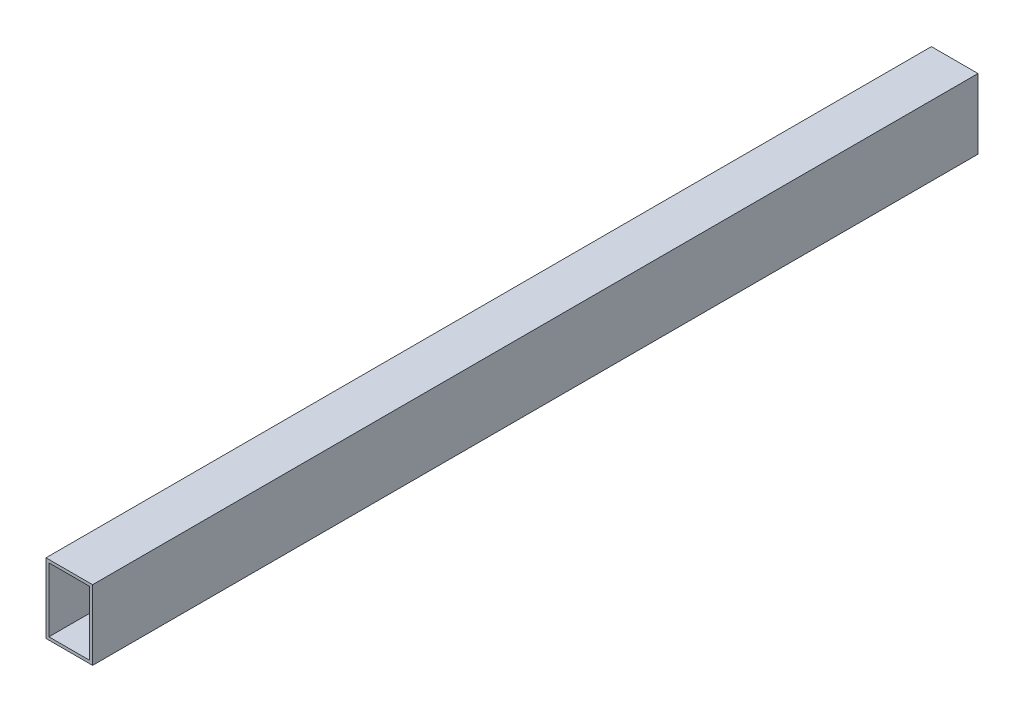
ISO-10303-21;
HEADER;
FILE_DESCRIPTION(('STEP AP214'),'2;1');
FILE_NAME('part.step','',(''),(''),'','','');
FILE_SCHEMA(('AUTOMOTIVE_DESIGN { 1 0 10303 214 1 1 1 1 }'));
ENDSEC;
DATA;
#1=APPLICATION_CONTEXT('core data for automotive mechanical design processes');
#2=APPLICATION_PROTOCOL_DEFINITION('international standard','automotive_design',2000,#1);
#3=PRODUCT_CONTEXT('',#1,'mechanical');
#4=PRODUCT('Part','Part','',(#3));
#5=PRODUCT_RELATED_PRODUCT_CATEGORY('part','',(#4));
#6=PRODUCT_DEFINITION_FORMATION('','',#4);
#7=PRODUCT_DEFINITION_CONTEXT('part definition',#1,'design');
#8=PRODUCT_DEFINITION('design','',#6,#7);
#9=PRODUCT_DEFINITION_SHAPE('','',#8);
#10=(LENGTH_UNIT() NAMED_UNIT(*) SI_UNIT(.MILLI.,.METRE.));
#11=(NAMED_UNIT(*) PLANE_ANGLE_UNIT() SI_UNIT($,.RADIAN.));
#12=(NAMED_UNIT(*) SI_UNIT($,.STERADIAN.) SOLID_ANGLE_UNIT());
#13=UNCERTAINTY_MEASURE_WITH_UNIT(LENGTH_MEASURE(1.E-05),#10,'distance_accuracy_value','');
#14=(GEOMETRIC_REPRESENTATION_CONTEXT(3) GLOBAL_UNCERTAINTY_ASSIGNED_CONTEXT((#13)) GLOBAL_UNIT_ASSIGNED_CONTEXT((#10,
#11,#12)) REPRESENTATION_CONTEXT('',''));
#15=CARTESIAN_POINT('',(0.,0.,0.));
#16=DIRECTION('',(0.,0.,1.));
#17=DIRECTION('',(1.,0.,0.));
#18=AXIS2_PLACEMENT_3D('',#15,#16,#17);
#19=CARTESIAN_POINT('',(0.,0.,965.2));
#20=DIRECTION('',(0.,0.,1.));
#21=DIRECTION('',(1.,0.,0.));
#22=AXIS2_PLACEMENT_3D('',#19,#20,#21);
#23=PLANE('',#22);
#24=DIRECTION('',(0.,1.,0.));
#25=VECTOR('',#24,1.);
#26=CARTESIAN_POINT('',(25.4,38.1,965.2));
#27=LINE('',#26,#25);
#28=CARTESIAN_POINT('',(25.4,-38.1,965.2));
#29=VERTEX_POINT('',#28);
#30=CARTESIAN_POINT('',(25.4,38.1,965.2));
#31=VERTEX_POINT('',#30);
#32=EDGE_CURVE('E153',#29,#31,#27,.T.);
#33=ORIENTED_EDGE('',*,*,#32,.T.);
#34=DIRECTION('',(-1.,0.,0.));
#35=VECTOR('',#34,1.);
#36=CARTESIAN_POINT('',(-25.4,38.1,965.2));
#37=LINE('',#36,#35);
#38=CARTESIAN_POINT('',(-25.4,38.1,965.2));
#39=VERTEX_POINT('',#38);
#40=EDGE_CURVE('E157',#31,#39,#37,.T.);
#41=ORIENTED_EDGE('',*,*,#40,.T.);
#42=DIRECTION('',(0.,-1.,0.));
#43=VECTOR('',#42,1.);
#44=CARTESIAN_POINT('',(-25.4,38.1,965.2));
#45=LINE('',#44,#43);
#46=CARTESIAN_POINT('',(-25.3999999999999,-38.1,965.2));
#47=VERTEX_POINT('',#46);
#48=EDGE_CURVE('E161',#39,#47,#45,.T.);
#49=ORIENTED_EDGE('',*,*,#48,.T.);
#50=DIRECTION('',(1.,0.,0.));
#51=VECTOR('',#50,1.);
#52=CARTESIAN_POINT('',(-25.3999999999999,-38.1,965.2));
#53=LINE('',#52,#51);
#54=EDGE_CURVE('E164',#47,#29,#53,.T.);
#55=ORIENTED_EDGE('',*,*,#54,.T.);
#56=EDGE_LOOP('',(#33,#41,#49,#55));
#57=FACE_BOUND('',#56,.T.);
#58=DIRECTION('',(1.,0.,0.));
#59=VECTOR('',#58,1.);
#60=CARTESIAN_POINT('',(-22.225,-34.925,965.2));
#61=LINE('',#60,#59);
#62=CARTESIAN_POINT('',(-22.225,-34.925,965.2));
#63=VERTEX_POINT('',#62);
#64=CARTESIAN_POINT('',(22.225,-34.925,965.2));
#65=VERTEX_POINT('',#64);
#66=EDGE_CURVE('E114',#63,#65,#61,.T.);
#67=ORIENTED_EDGE('',*,*,#66,.F.);
#68=DIRECTION('',(0.,-1.,0.));
#69=VECTOR('',#68,1.);
#70=CARTESIAN_POINT('',(-22.225,34.925,965.2));
#71=LINE('',#70,#69);
#72=CARTESIAN_POINT('',(-22.225,34.925,965.2));
#73=VERTEX_POINT('',#72);
#74=EDGE_CURVE('E105',#73,#63,#71,.T.);
#75=ORIENTED_EDGE('',*,*,#74,.F.);
#76=DIRECTION('',(-1.,0.,0.));
#77=VECTOR('',#76,1.);
#78=CARTESIAN_POINT('',(-22.225,34.925,965.2));
#79=LINE('',#78,#77);
#80=CARTESIAN_POINT('',(22.225,34.925,965.2));
#81=VERTEX_POINT('',#80);
#82=EDGE_CURVE('E131',#81,#73,#79,.T.);
#83=ORIENTED_EDGE('',*,*,#82,.F.);
#84=DIRECTION('',(0.,1.,0.));
#85=VECTOR('',#84,1.);
#86=CARTESIAN_POINT('',(22.225,34.925,965.2));
#87=LINE('',#86,#85);
#88=EDGE_CURVE('E127',#65,#81,#87,.T.);
#89=ORIENTED_EDGE('',*,*,#88,.F.);
#90=EDGE_LOOP('',(#67,#75,#83,#89));
#91=FACE_BOUND('',#90,.T.);
#92=ADVANCED_FACE('F39',(#57,#91),#23,.T.);
#93=CARTESIAN_POINT('',(0.,0.,0.));
#94=DIRECTION('',(0.,0.,1.));
#95=DIRECTION('',(1.,0.,0.));
#96=AXIS2_PLACEMENT_3D('',#93,#94,#95);
#97=PLANE('',#96);
#98=DIRECTION('',(0.,1.,0.));
#99=VECTOR('',#98,1.);
#100=CARTESIAN_POINT('',(25.4,38.1,0.));
#101=LINE('',#100,#99);
#102=CARTESIAN_POINT('',(25.4,-38.1,0.));
#103=VERTEX_POINT('',#102);
#104=CARTESIAN_POINT('',(25.4,38.1,0.));
#105=VERTEX_POINT('',#104);
#106=EDGE_CURVE('E123',#103,#105,#101,.T.);
#107=ORIENTED_EDGE('',*,*,#106,.F.);
#108=DIRECTION('',(1.,0.,0.));
#109=VECTOR('',#108,1.);
#110=CARTESIAN_POINT('',(-25.3999999999999,-38.1,0.));
#111=LINE('',#110,#109);
#112=CARTESIAN_POINT('',(-25.3999999999999,-38.1,0.));
#113=VERTEX_POINT('',#112);
#114=EDGE_CURVE('E158',#113,#103,#111,.T.);
#115=ORIENTED_EDGE('',*,*,#114,.F.);
#116=DIRECTION('',(0.,-1.,0.));
#117=VECTOR('',#116,1.);
#118=CARTESIAN_POINT('',(-25.4,38.1,0.));
#119=LINE('',#118,#117);
#120=CARTESIAN_POINT('',(-25.4,38.1,0.));
#121=VERTEX_POINT('',#120);
#122=EDGE_CURVE('E174',#121,#113,#119,.T.);
#123=ORIENTED_EDGE('',*,*,#122,.F.);
#124=DIRECTION('',(-1.,0.,0.));
#125=VECTOR('',#124,1.);
#126=CARTESIAN_POINT('',(-25.4,38.1,0.));
#127=LINE('',#126,#125);
#128=EDGE_CURVE('E171',#105,#121,#127,.T.);
#129=ORIENTED_EDGE('',*,*,#128,.F.);
#130=EDGE_LOOP('',(#107,#115,#123,#129));
#131=FACE_BOUND('',#130,.T.);
#132=DIRECTION('',(0.,-1.,0.));
#133=VECTOR('',#132,1.);
#134=CARTESIAN_POINT('',(-22.225,34.925,0.));
#135=LINE('',#134,#133);
#136=CARTESIAN_POINT('',(-22.225,34.925,0.));
#137=VERTEX_POINT('',#136);
#138=CARTESIAN_POINT('',(-22.225,-34.925,0.));
#139=VERTEX_POINT('',#138);
#140=EDGE_CURVE('E63',#137,#139,#135,.T.);
#141=ORIENTED_EDGE('',*,*,#140,.T.);
#142=DIRECTION('',(1.,0.,0.));
#143=VECTOR('',#142,1.);
#144=CARTESIAN_POINT('',(-22.225,-34.925,0.));
#145=LINE('',#144,#143);
#146=CARTESIAN_POINT('',(22.225,-34.925,0.));
#147=VERTEX_POINT('',#146);
#148=EDGE_CURVE('E121',#139,#147,#145,.T.);
#149=ORIENTED_EDGE('',*,*,#148,.T.);
#150=DIRECTION('',(0.,1.,0.));
#151=VECTOR('',#150,1.);
#152=CARTESIAN_POINT('',(22.225,34.925,0.));
#153=LINE('',#152,#151);
#154=CARTESIAN_POINT('',(22.225,34.925,0.));
#155=VERTEX_POINT('',#154);
#156=EDGE_CURVE('E140',#147,#155,#153,.T.);
#157=ORIENTED_EDGE('',*,*,#156,.T.);
#158=DIRECTION('',(-1.,0.,0.));
#159=VECTOR('',#158,1.);
#160=CARTESIAN_POINT('',(-22.225,34.925,0.));
#161=LINE('',#160,#159);
#162=EDGE_CURVE('E115',#155,#137,#161,.T.);
#163=ORIENTED_EDGE('',*,*,#162,.T.);
#164=EDGE_LOOP('',(#141,#149,#157,#163));
#165=FACE_BOUND('',#164,.T.);
#166=ADVANCED_FACE('F197',(#131,#165),#97,.F.);
#167=CARTESIAN_POINT('',(25.4,38.1,965.2));
#168=DIRECTION('',(-1.,0.,0.));
#169=DIRECTION('',(0.,-1.,0.));
#170=AXIS2_PLACEMENT_3D('',#167,#168,#169);
#171=PLANE('',#170);
#172=ORIENTED_EDGE('',*,*,#106,.T.);
#173=DIRECTION('',(0.,0.,-1.));
#174=VECTOR('',#173,1.);
#175=CARTESIAN_POINT('',(25.4,38.1,965.2));
#176=LINE('',#175,#174);
#177=EDGE_CURVE('E11',#31,#105,#176,.T.);
#178=ORIENTED_EDGE('',*,*,#177,.F.);
#179=ORIENTED_EDGE('',*,*,#32,.F.);
#180=DIRECTION('',(0.,0.,-1.));
#181=VECTOR('',#180,1.);
#182=CARTESIAN_POINT('',(25.4,-38.1,965.2));
#183=LINE('',#182,#181);
#184=EDGE_CURVE('E167',#29,#103,#183,.T.);
#185=ORIENTED_EDGE('',*,*,#184,.T.);
#186=EDGE_LOOP('',(#172,#178,#179,#185));
#187=FACE_BOUND('',#186,.T.);
#188=ADVANCED_FACE('F41',(#187),#171,.F.);
#189=CARTESIAN_POINT('',(-25.4,38.1,965.2));
#190=DIRECTION('',(0.,-1.,0.));
#191=DIRECTION('',(0.,0.,-1.));
#192=AXIS2_PLACEMENT_3D('',#189,#190,#191);
#193=PLANE('',#192);
#194=ORIENTED_EDGE('',*,*,#128,.T.);
#195=DIRECTION('',(0.,0.,-1.));
#196=VECTOR('',#195,1.);
#197=CARTESIAN_POINT('',(-25.4,38.1,965.2));
#198=LINE('',#197,#196);
#199=EDGE_CURVE('E48',#39,#121,#198,.T.);
#200=ORIENTED_EDGE('',*,*,#199,.F.);
#201=ORIENTED_EDGE('',*,*,#40,.F.);
#202=ORIENTED_EDGE('',*,*,#177,.T.);
#203=EDGE_LOOP('',(#194,#200,#201,#202));
#204=FACE_BOUND('',#203,.T.);
#205=ADVANCED_FACE('F207',(#204),#193,.F.);
#206=CARTESIAN_POINT('',(-25.4,38.1,965.2));
#207=DIRECTION('',(1.,0.,0.));
#208=DIRECTION('',(0.,1.,0.));
#209=AXIS2_PLACEMENT_3D('',#206,#207,#208);
#210=PLANE('',#209);
#211=ORIENTED_EDGE('',*,*,#122,.T.);
#212=DIRECTION('',(0.,0.,-1.));
#213=VECTOR('',#212,1.);
#214=CARTESIAN_POINT('',(-25.3999999999999,-38.1,965.2));
#215=LINE('',#214,#213);
#216=EDGE_CURVE('E182',#47,#113,#215,.T.);
#217=ORIENTED_EDGE('',*,*,#216,.F.);
#218=ORIENTED_EDGE('',*,*,#48,.F.);
#219=ORIENTED_EDGE('',*,*,#199,.T.);
#220=EDGE_LOOP('',(#211,#217,#218,#219));
#221=FACE_BOUND('',#220,.T.);
#222=ADVANCED_FACE('F191',(#221),#210,.F.);
#223=CARTESIAN_POINT('',(-25.3999999999999,-38.1,965.2));
#224=DIRECTION('',(0.,1.,0.));
#225=DIRECTION('',(0.,0.,1.));
#226=AXIS2_PLACEMENT_3D('',#223,#224,#225);
#227=PLANE('',#226);
#228=ORIENTED_EDGE('',*,*,#114,.T.);
#229=ORIENTED_EDGE('',*,*,#184,.F.);
#230=ORIENTED_EDGE('',*,*,#54,.F.);
#231=ORIENTED_EDGE('',*,*,#216,.T.);
#232=EDGE_LOOP('',(#228,#229,#230,#231));
#233=FACE_BOUND('',#232,.T.);
#234=ADVANCED_FACE('F201',(#233),#227,.F.);
#235=CARTESIAN_POINT('',(-22.225,34.925,965.2));
#236=DIRECTION('',(1.,0.,0.));
#237=DIRECTION('',(0.,1.,0.));
#238=AXIS2_PLACEMENT_3D('',#235,#236,#237);
#239=PLANE('',#238);
#240=ORIENTED_EDGE('',*,*,#140,.F.);
#241=DIRECTION('',(0.,0.,-1.));
#242=VECTOR('',#241,1.);
#243=CARTESIAN_POINT('',(-22.225,34.925,965.2));
#244=LINE('',#243,#242);
#245=EDGE_CURVE('E109',#73,#137,#244,.T.);
#246=ORIENTED_EDGE('',*,*,#245,.F.);
#247=ORIENTED_EDGE('',*,*,#74,.T.);
#248=DIRECTION('',(0.,0.,-1.));
#249=VECTOR('',#248,1.);
#250=CARTESIAN_POINT('',(-22.225,-34.925,965.2));
#251=LINE('',#250,#249);
#252=EDGE_CURVE('E108',#63,#139,#251,.T.);
#253=ORIENTED_EDGE('',*,*,#252,.T.);
#254=EDGE_LOOP('',(#240,#246,#247,#253));
#255=FACE_BOUND('',#254,.T.);
#256=ADVANCED_FACE('F107',(#255),#239,.T.);
#257=CARTESIAN_POINT('',(-22.225,-34.925,965.2));
#258=DIRECTION('',(0.,1.,0.));
#259=DIRECTION('',(-1.,0.,0.));
#260=AXIS2_PLACEMENT_3D('',#257,#258,#259);
#261=PLANE('',#260);
#262=ORIENTED_EDGE('',*,*,#148,.F.);
#263=ORIENTED_EDGE('',*,*,#252,.F.);
#264=ORIENTED_EDGE('',*,*,#66,.T.);
#265=DIRECTION('',(0.,0.,-1.));
#266=VECTOR('',#265,1.);
#267=CARTESIAN_POINT('',(22.225,-34.925,965.2));
#268=LINE('',#267,#266);
#269=EDGE_CURVE('E124',#65,#147,#268,.T.);
#270=ORIENTED_EDGE('',*,*,#269,.T.);
#271=EDGE_LOOP('',(#262,#263,#264,#270));
#272=FACE_BOUND('',#271,.T.);
#273=ADVANCED_FACE('F118',(#272),#261,.T.);
#274=CARTESIAN_POINT('',(22.225,34.925,965.2));
#275=DIRECTION('',(-1.,0.,0.));
#276=DIRECTION('',(0.,-1.,0.));
#277=AXIS2_PLACEMENT_3D('',#274,#275,#276);
#278=PLANE('',#277);
#279=ORIENTED_EDGE('',*,*,#156,.F.);
#280=ORIENTED_EDGE('',*,*,#269,.F.);
#281=ORIENTED_EDGE('',*,*,#88,.T.);
#282=DIRECTION('',(0.,0.,-1.));
#283=VECTOR('',#282,1.);
#284=CARTESIAN_POINT('',(22.225,34.925,965.2));
#285=LINE('',#284,#283);
#286=EDGE_CURVE('E55',#81,#155,#285,.T.);
#287=ORIENTED_EDGE('',*,*,#286,.T.);
#288=EDGE_LOOP('',(#279,#280,#281,#287));
#289=FACE_BOUND('',#288,.T.);
#290=ADVANCED_FACE('F230',(#289),#278,.T.);
#291=CARTESIAN_POINT('',(-22.225,34.925,965.2));
#292=DIRECTION('',(0.,-1.,0.));
#293=DIRECTION('',(1.,0.,0.));
#294=AXIS2_PLACEMENT_3D('',#291,#292,#293);
#295=PLANE('',#294);
#296=ORIENTED_EDGE('',*,*,#162,.F.);
#297=ORIENTED_EDGE('',*,*,#286,.F.);
#298=ORIENTED_EDGE('',*,*,#82,.T.);
#299=ORIENTED_EDGE('',*,*,#245,.T.);
#300=EDGE_LOOP('',(#296,#297,#298,#299));
#301=FACE_BOUND('',#300,.T.);
#302=ADVANCED_FACE('F234',(#301),#295,.T.);
#303=CLOSED_SHELL('',(#92,#166,#188,#205,#222,#234,#256,#273,#290,#302));
#304=MANIFOLD_SOLID_BREP('B2',#303);
#305=ADVANCED_BREP_SHAPE_REPRESENTATION('',(#18,#304),#14);
#306=SHAPE_DEFINITION_REPRESENTATION(#9,#305);
ENDSEC;
END-ISO-10303-21;
